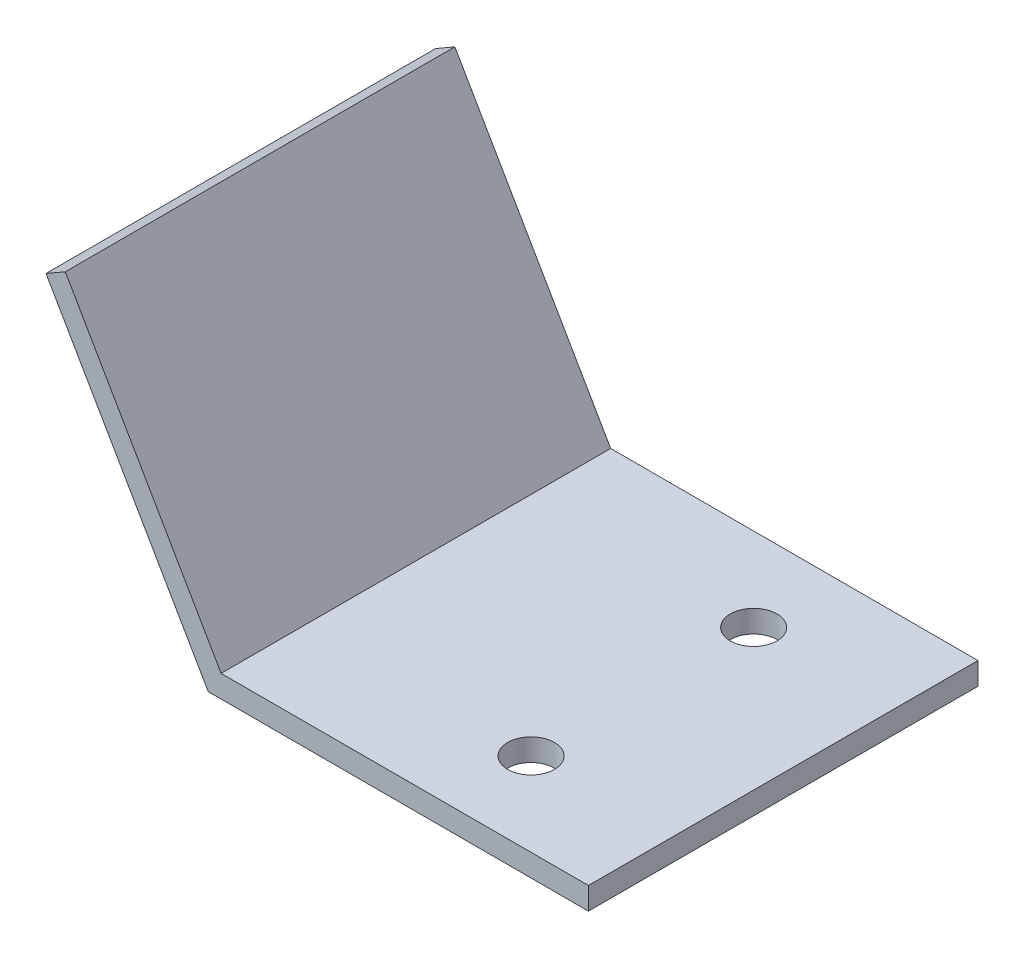
ISO-10303-21;
HEADER;
FILE_DESCRIPTION(('STEP AP214'),'2;1');
FILE_NAME('part.step','',(''),(''),'','','');
FILE_SCHEMA(('AUTOMOTIVE_DESIGN { 1 0 10303 214 1 1 1 1 }'));
ENDSEC;
DATA;
#1=APPLICATION_CONTEXT('core data for automotive mechanical design processes');
#2=APPLICATION_PROTOCOL_DEFINITION('international standard','automotive_design',2000,#1);
#3=PRODUCT_CONTEXT('',#1,'mechanical');
#4=PRODUCT('Part','Part','',(#3));
#5=PRODUCT_RELATED_PRODUCT_CATEGORY('part','',(#4));
#6=PRODUCT_DEFINITION_FORMATION('','',#4);
#7=PRODUCT_DEFINITION_CONTEXT('part definition',#1,'design');
#8=PRODUCT_DEFINITION('design','',#6,#7);
#9=PRODUCT_DEFINITION_SHAPE('','',#8);
#10=(LENGTH_UNIT() NAMED_UNIT(*) SI_UNIT(.MILLI.,.METRE.));
#11=(NAMED_UNIT(*) PLANE_ANGLE_UNIT() SI_UNIT($,.RADIAN.));
#12=(NAMED_UNIT(*) SI_UNIT($,.STERADIAN.) SOLID_ANGLE_UNIT());
#13=UNCERTAINTY_MEASURE_WITH_UNIT(LENGTH_MEASURE(1.E-05),#10,'distance_accuracy_value','');
#14=(GEOMETRIC_REPRESENTATION_CONTEXT(3) GLOBAL_UNCERTAINTY_ASSIGNED_CONTEXT((#13)) GLOBAL_UNIT_ASSIGNED_CONTEXT((#10,
#11,#12)) REPRESENTATION_CONTEXT('',''));
#15=CARTESIAN_POINT('',(0.,0.,0.));
#16=DIRECTION('',(0.,0.,1.));
#17=DIRECTION('',(1.,0.,0.));
#18=AXIS2_PLACEMENT_3D('',#15,#16,#17);
#19=CARTESIAN_POINT('',(-14.5773502691896,25.2487113059643,35.));
#20=DIRECTION('',(0.86602540378444,0.499999999999998,0.));
#21=DIRECTION('',(-0.499999999999998,0.86602540378444,0.));
#22=AXIS2_PLACEMENT_3D('',#19,#20,#21);
#23=PLANE('',#22);
#24=CARTESIAN_POINT('',(-7.49999999999997,12.9903810567666,27.5));
#25=DIRECTION('',(-0.86602540378444,-0.499999999999998,0.));
#26=DIRECTION('',(0.499999999999998,-0.86602540378444,0.));
#27=AXIS2_PLACEMENT_3D('',#24,#25,#26);
#28=CIRCLE('',#27,5.);
#29=CARTESIAN_POINT('',(-4.99999999999998,8.6602540378444,27.5));
#30=VERTEX_POINT('',#29);
#31=EDGE_CURVE('E191',#30,#30,#28,.T.);
#32=ORIENTED_EDGE('',*,*,#31,.F.);
#33=EDGE_LOOP('',(#32));
#34=FACE_BOUND('',#33,.T.);
#35=CARTESIAN_POINT('',(-7.49999999999997,12.9903810567666,7.5));
#36=DIRECTION('',(-0.86602540378444,-0.499999999999998,0.));
#37=DIRECTION('',(-0.499999999999998,0.86602540378444,0.));
#38=AXIS2_PLACEMENT_3D('',#35,#36,#37);
#39=CIRCLE('',#38,5.);
#40=CARTESIAN_POINT('',(-4.99999999999998,8.6602540378444,7.5));
#41=VERTEX_POINT('',#40);
#42=EDGE_CURVE('E194',#41,#41,#39,.T.);
#43=ORIENTED_EDGE('',*,*,#42,.F.);
#44=EDGE_LOOP('',(#43));
#45=FACE_BOUND('',#44,.T.);
#46=DIRECTION('',(0.499999999999998,-0.86602540378444,0.));
#47=VECTOR('',#46,1.);
#48=CARTESIAN_POINT('',(-14.5773502691896,25.2487113059643,0.));
#49=LINE('',#48,#47);
#50=CARTESIAN_POINT('',(-14.5773502691896,25.2487113059643,0.));
#51=VERTEX_POINT('',#50);
#52=CARTESIAN_POINT('',(0.,0.,0.));
#53=VERTEX_POINT('',#52);
#54=EDGE_CURVE('E126',#51,#53,#49,.T.);
#55=ORIENTED_EDGE('',*,*,#54,.T.);
#56=DIRECTION('',(0.,0.,-1.));
#57=VECTOR('',#56,1.);
#58=CARTESIAN_POINT('',(0.,0.,35.));
#59=LINE('',#58,#57);
#60=CARTESIAN_POINT('',(0.,0.,35.));
#61=VERTEX_POINT('',#60);
#62=EDGE_CURVE('E11',#61,#53,#59,.T.);
#63=ORIENTED_EDGE('',*,*,#62,.F.);
#64=DIRECTION('',(0.499999999999998,-0.86602540378444,0.));
#65=VECTOR('',#64,1.);
#66=CARTESIAN_POINT('',(-14.5773502691896,25.2487113059643,35.));
#67=LINE('',#66,#65);
#68=CARTESIAN_POINT('',(-14.5773502691896,25.2487113059643,35.));
#69=VERTEX_POINT('',#68);
#70=EDGE_CURVE('E136',#69,#61,#67,.T.);
#71=ORIENTED_EDGE('',*,*,#70,.F.);
#72=DIRECTION('',(0.,0.,-1.));
#73=VECTOR('',#72,1.);
#74=CARTESIAN_POINT('',(-14.5773502691896,25.2487113059643,35.));
#75=LINE('',#74,#73);
#76=EDGE_CURVE('E122',#69,#51,#75,.T.);
#77=ORIENTED_EDGE('',*,*,#76,.T.);
#78=EDGE_LOOP('',(#55,#63,#71,#77));
#79=FACE_BOUND('',#78,.T.);
#80=ADVANCED_FACE('F40',(#34,#45,#79),#23,.F.);
#81=CARTESIAN_POINT('',(0.,0.,35.));
#82=DIRECTION('',(0.,1.,0.));
#83=DIRECTION('',(-1.,0.,0.));
#84=AXIS2_PLACEMENT_3D('',#81,#82,#83);
#85=PLANE('',#84);
#86=CARTESIAN_POINT('',(21.5,0.,27.5));
#87=DIRECTION('',(0.,-1.,0.));
#88=DIRECTION('',(1.,0.,0.));
#89=AXIS2_PLACEMENT_3D('',#86,#87,#88);
#90=CIRCLE('',#89,2.1);
#91=CARTESIAN_POINT('',(23.6,0.,27.5));
#92=VERTEX_POINT('',#91);
#93=EDGE_CURVE('E143',#92,#92,#90,.T.);
#94=ORIENTED_EDGE('',*,*,#93,.F.);
#95=EDGE_LOOP('',(#94));
#96=FACE_BOUND('',#95,.T.);
#97=CARTESIAN_POINT('',(21.5,0.,7.50000000000001));
#98=DIRECTION('',(0.,-1.,0.));
#99=DIRECTION('',(-1.,0.,0.));
#100=AXIS2_PLACEMENT_3D('',#97,#98,#99);
#101=CIRCLE('',#100,2.1);
#102=CARTESIAN_POINT('',(23.6,0.,7.50000000000001));
#103=VERTEX_POINT('',#102);
#104=EDGE_CURVE('E148',#103,#103,#101,.T.);
#105=ORIENTED_EDGE('',*,*,#104,.F.);
#106=EDGE_LOOP('',(#105));
#107=FACE_BOUND('',#106,.T.);
#108=DIRECTION('',(1.,0.,0.));
#109=VECTOR('',#108,1.);
#110=CARTESIAN_POINT('',(0.,0.,0.));
#111=LINE('',#110,#109);
#112=CARTESIAN_POINT('',(34.1547005383792,0.,0.));
#113=VERTEX_POINT('',#112);
#114=EDGE_CURVE('E129',#53,#113,#111,.T.);
#115=ORIENTED_EDGE('',*,*,#114,.T.);
#116=DIRECTION('',(0.,0.,-1.));
#117=VECTOR('',#116,1.);
#118=CARTESIAN_POINT('',(34.1547005383792,0.,35.));
#119=LINE('',#118,#117);
#120=CARTESIAN_POINT('',(34.1547005383792,0.,35.));
#121=VERTEX_POINT('',#120);
#122=EDGE_CURVE('E49',#121,#113,#119,.T.);
#123=ORIENTED_EDGE('',*,*,#122,.F.);
#124=DIRECTION('',(1.,0.,0.));
#125=VECTOR('',#124,1.);
#126=CARTESIAN_POINT('',(0.,0.,35.));
#127=LINE('',#126,#125);
#128=EDGE_CURVE('E95',#61,#121,#127,.T.);
#129=ORIENTED_EDGE('',*,*,#128,.F.);
#130=ORIENTED_EDGE('',*,*,#62,.T.);
#131=EDGE_LOOP('',(#115,#123,#129,#130));
#132=FACE_BOUND('',#131,.T.);
#133=ADVANCED_FACE('F162',(#96,#107,#132),#85,.F.);
#134=CARTESIAN_POINT('',(34.1547005383792,0.,35.));
#135=DIRECTION('',(-1.,0.,0.));
#136=DIRECTION('',(0.,0.,1.));
#137=AXIS2_PLACEMENT_3D('',#134,#135,#136);
#138=PLANE('',#137);
#139=DIRECTION('',(0.,1.,0.));
#140=VECTOR('',#139,1.);
#141=CARTESIAN_POINT('',(34.1547005383792,0.,0.));
#142=LINE('',#141,#140);
#143=CARTESIAN_POINT('',(34.1547005383792,2.,0.));
#144=VERTEX_POINT('',#143);
#145=EDGE_CURVE('E131',#113,#144,#142,.T.);
#146=ORIENTED_EDGE('',*,*,#145,.T.);
#147=DIRECTION('',(0.,0.,-1.));
#148=VECTOR('',#147,1.);
#149=CARTESIAN_POINT('',(34.1547005383792,2.,35.));
#150=LINE('',#149,#148);
#151=CARTESIAN_POINT('',(34.1547005383792,2.,35.));
#152=VERTEX_POINT('',#151);
#153=EDGE_CURVE('E117',#152,#144,#150,.T.);
#154=ORIENTED_EDGE('',*,*,#153,.F.);
#155=DIRECTION('',(0.,1.,0.));
#156=VECTOR('',#155,1.);
#157=CARTESIAN_POINT('',(34.1547005383792,0.,35.));
#158=LINE('',#157,#156);
#159=EDGE_CURVE('E108',#121,#152,#158,.T.);
#160=ORIENTED_EDGE('',*,*,#159,.F.);
#161=ORIENTED_EDGE('',*,*,#122,.T.);
#162=EDGE_LOOP('',(#146,#154,#160,#161));
#163=FACE_BOUND('',#162,.T.);
#164=ADVANCED_FACE('F165',(#163),#138,.F.);
#165=CARTESIAN_POINT('',(34.1547005383792,2.,35.));
#166=DIRECTION('',(0.,-1.,0.));
#167=DIRECTION('',(1.,0.,0.));
#168=AXIS2_PLACEMENT_3D('',#165,#166,#167);
#169=PLANE('',#168);
#170=CARTESIAN_POINT('',(21.5,2.,27.5));
#171=DIRECTION('',(0.,-1.,0.));
#172=DIRECTION('',(1.,0.,0.));
#173=AXIS2_PLACEMENT_3D('',#170,#171,#172);
#174=CIRCLE('',#173,2.1);
#175=CARTESIAN_POINT('',(23.6,2.,27.5));
#176=VERTEX_POINT('',#175);
#177=EDGE_CURVE('E43',#176,#176,#174,.T.);
#178=ORIENTED_EDGE('',*,*,#177,.T.);
#179=EDGE_LOOP('',(#178));
#180=FACE_BOUND('',#179,.T.);
#181=CARTESIAN_POINT('',(21.5,2.,7.50000000000001));
#182=DIRECTION('',(0.,-1.,0.));
#183=DIRECTION('',(1.,0.,0.));
#184=AXIS2_PLACEMENT_3D('',#181,#182,#183);
#185=CIRCLE('',#184,2.1);
#186=CARTESIAN_POINT('',(23.6,2.,7.50000000000001));
#187=VERTEX_POINT('',#186);
#188=EDGE_CURVE('E141',#187,#187,#185,.T.);
#189=ORIENTED_EDGE('',*,*,#188,.T.);
#190=EDGE_LOOP('',(#189));
#191=FACE_BOUND('',#190,.T.);
#192=DIRECTION('',(-1.,0.,0.));
#193=VECTOR('',#192,1.);
#194=CARTESIAN_POINT('',(34.1547005383792,2.,0.));
#195=LINE('',#194,#193);
#196=CARTESIAN_POINT('',(1.15470053837926,2.,0.));
#197=VERTEX_POINT('',#196);
#198=EDGE_CURVE('E116',#144,#197,#195,.T.);
#199=ORIENTED_EDGE('',*,*,#198,.T.);
#200=DIRECTION('',(0.,0.,-1.));
#201=VECTOR('',#200,1.);
#202=CARTESIAN_POINT('',(1.15470053837926,2.,35.));
#203=LINE('',#202,#201);
#204=CARTESIAN_POINT('',(1.15470053837926,2.,35.));
#205=VERTEX_POINT('',#204);
#206=EDGE_CURVE('E113',#205,#197,#203,.T.);
#207=ORIENTED_EDGE('',*,*,#206,.F.);
#208=DIRECTION('',(-1.,0.,0.));
#209=VECTOR('',#208,1.);
#210=CARTESIAN_POINT('',(34.1547005383792,2.,35.));
#211=LINE('',#210,#209);
#212=EDGE_CURVE('E102',#152,#205,#211,.T.);
#213=ORIENTED_EDGE('',*,*,#212,.F.);
#214=ORIENTED_EDGE('',*,*,#153,.T.);
#215=EDGE_LOOP('',(#199,#207,#213,#214));
#216=FACE_BOUND('',#215,.T.);
#217=ADVANCED_FACE('F114',(#180,#191,#216),#169,.F.);
#218=CARTESIAN_POINT('',(1.15470053837926,2.,35.));
#219=DIRECTION('',(-0.86602540378444,-0.499999999999998,0.));
#220=DIRECTION('',(0.499999999999998,-0.86602540378444,0.));
#221=AXIS2_PLACEMENT_3D('',#218,#219,#220);
#222=PLANE('',#221);
#223=DIRECTION('',(-0.499999999999998,0.86602540378444,0.));
#224=VECTOR('',#223,1.);
#225=CARTESIAN_POINT('',(1.15470053837926,2.,0.));
#226=LINE('',#225,#224);
#227=CARTESIAN_POINT('',(-12.8452994616207,26.2487113059643,0.));
#228=VERTEX_POINT('',#227);
#229=EDGE_CURVE('E81',#197,#228,#226,.T.);
#230=ORIENTED_EDGE('',*,*,#229,.T.);
#231=DIRECTION('',(0.,0.,-1.));
#232=VECTOR('',#231,1.);
#233=CARTESIAN_POINT('',(-12.8452994616207,26.2487113059643,35.));
#234=LINE('',#233,#232);
#235=CARTESIAN_POINT('',(-12.8452994616207,26.2487113059643,35.));
#236=VERTEX_POINT('',#235);
#237=EDGE_CURVE('E118',#236,#228,#234,.T.);
#238=ORIENTED_EDGE('',*,*,#237,.F.);
#239=DIRECTION('',(-0.499999999999998,0.86602540378444,0.));
#240=VECTOR('',#239,1.);
#241=CARTESIAN_POINT('',(1.15470053837926,2.,35.));
#242=LINE('',#241,#240);
#243=EDGE_CURVE('E106',#205,#236,#242,.T.);
#244=ORIENTED_EDGE('',*,*,#243,.F.);
#245=ORIENTED_EDGE('',*,*,#206,.T.);
#246=EDGE_LOOP('',(#230,#238,#244,#245));
#247=FACE_BOUND('',#246,.T.);
#248=ADVANCED_FACE('F120',(#247),#222,.F.);
#249=CARTESIAN_POINT('',(-12.8452994616207,26.2487113059643,35.));
#250=DIRECTION('',(0.5,-0.866025403784438,0.));
#251=DIRECTION('',(0.866025403784438,0.5,0.));
#252=AXIS2_PLACEMENT_3D('',#249,#250,#251);
#253=PLANE('',#252);
#254=DIRECTION('',(-0.866025403784438,-0.5,0.));
#255=VECTOR('',#254,1.);
#256=CARTESIAN_POINT('',(-12.8452994616207,26.2487113059643,0.));
#257=LINE('',#256,#255);
#258=EDGE_CURVE('E87',#228,#51,#257,.T.);
#259=ORIENTED_EDGE('',*,*,#258,.T.);
#260=ORIENTED_EDGE('',*,*,#76,.F.);
#261=DIRECTION('',(-0.866025403784438,-0.5,0.));
#262=VECTOR('',#261,1.);
#263=CARTESIAN_POINT('',(-12.8452994616207,26.2487113059643,35.));
#264=LINE('',#263,#262);
#265=EDGE_CURVE('E58',#236,#69,#264,.T.);
#266=ORIENTED_EDGE('',*,*,#265,.F.);
#267=ORIENTED_EDGE('',*,*,#237,.T.);
#268=EDGE_LOOP('',(#259,#260,#266,#267));
#269=FACE_BOUND('',#268,.T.);
#270=ADVANCED_FACE('F170',(#269),#253,.F.);
#271=CARTESIAN_POINT('',(0.,0.,35.));
#272=DIRECTION('',(0.,0.,-1.));
#273=DIRECTION('',(-1.,0.,0.));
#274=AXIS2_PLACEMENT_3D('',#271,#272,#273);
#275=PLANE('',#274);
#276=ORIENTED_EDGE('',*,*,#70,.T.);
#277=ORIENTED_EDGE('',*,*,#128,.T.);
#278=ORIENTED_EDGE('',*,*,#159,.T.);
#279=ORIENTED_EDGE('',*,*,#212,.T.);
#280=ORIENTED_EDGE('',*,*,#243,.T.);
#281=ORIENTED_EDGE('',*,*,#265,.T.);
#282=EDGE_LOOP('',(#276,#277,#278,#279,#280,#281));
#283=FACE_BOUND('',#282,.T.);
#284=ADVANCED_FACE('F104',(#283),#275,.F.);
#285=CARTESIAN_POINT('',(0.,0.,0.));
#286=DIRECTION('',(0.,0.,-1.));
#287=DIRECTION('',(-1.,0.,0.));
#288=AXIS2_PLACEMENT_3D('',#285,#286,#287);
#289=PLANE('',#288);
#290=ORIENTED_EDGE('',*,*,#54,.F.);
#291=ORIENTED_EDGE('',*,*,#258,.F.);
#292=ORIENTED_EDGE('',*,*,#229,.F.);
#293=ORIENTED_EDGE('',*,*,#198,.F.);
#294=ORIENTED_EDGE('',*,*,#145,.F.);
#295=ORIENTED_EDGE('',*,*,#114,.F.);
#296=EDGE_LOOP('',(#290,#291,#292,#293,#294,#295));
#297=FACE_BOUND('',#296,.T.);
#298=ADVANCED_FACE('F168',(#297),#289,.T.);
#299=CARTESIAN_POINT('',(21.5,26.2487113059643,7.50000000000001));
#300=DIRECTION('',(0.,-1.,0.));
#301=DIRECTION('',(1.,0.,0.));
#302=AXIS2_PLACEMENT_3D('',#299,#300,#301);
#303=CYLINDRICAL_SURFACE('',#302,2.1);
#304=CARTESIAN_POINT('',(23.6,0.,7.50000000000001));
#305=CARTESIAN_POINT('',(23.6,0.0208333333333333,7.50000000000001));
#306=CARTESIAN_POINT('',(23.6,0.0416666666666667,7.50000000000001));
#307=CARTESIAN_POINT('',(23.6,0.0833333333333334,7.50000000000001));
#308=CARTESIAN_POINT('',(23.6,0.104166666666667,7.50000000000001));
#309=CARTESIAN_POINT('',(23.6,0.145833333333333,7.50000000000001));
#310=CARTESIAN_POINT('',(23.6,0.166666666666667,7.50000000000001));
#311=CARTESIAN_POINT('',(23.6,0.208333333333334,7.50000000000001));
#312=CARTESIAN_POINT('',(23.6,0.229166666666667,7.50000000000001));
#313=CARTESIAN_POINT('',(23.6,0.270833333333334,7.50000000000001));
#314=CARTESIAN_POINT('',(23.6,0.291666666666667,7.50000000000001));
#315=CARTESIAN_POINT('',(23.6,0.333333333333334,7.50000000000001));
#316=CARTESIAN_POINT('',(23.6,0.354166666666667,7.50000000000001));
#317=CARTESIAN_POINT('',(23.6,0.395833333333334,7.50000000000001));
#318=CARTESIAN_POINT('',(23.6,0.416666666666667,7.50000000000001));
#319=CARTESIAN_POINT('',(23.6,0.458333333333334,7.50000000000001));
#320=CARTESIAN_POINT('',(23.6,0.479166666666667,7.50000000000001));
#321=CARTESIAN_POINT('',(23.6,0.520833333333334,7.50000000000001));
#322=CARTESIAN_POINT('',(23.6,0.541666666666667,7.50000000000001));
#323=CARTESIAN_POINT('',(23.6,0.583333333333334,7.50000000000001));
#324=CARTESIAN_POINT('',(23.6,0.604166666666667,7.50000000000001));
#325=CARTESIAN_POINT('',(23.6,0.645833333333334,7.50000000000001));
#326=CARTESIAN_POINT('',(23.6,0.666666666666667,7.50000000000001));
#327=CARTESIAN_POINT('',(23.6,0.708333333333334,7.50000000000001));
#328=CARTESIAN_POINT('',(23.6,0.729166666666667,7.50000000000001));
#329=CARTESIAN_POINT('',(23.6,0.770833333333334,7.50000000000001));
#330=CARTESIAN_POINT('',(23.6,0.791666666666667,7.50000000000001));
#331=CARTESIAN_POINT('',(23.6,0.833333333333334,7.50000000000001));
#332=CARTESIAN_POINT('',(23.6,0.854166666666667,7.50000000000001));
#333=CARTESIAN_POINT('',(23.6,0.895833333333334,7.50000000000001));
#334=CARTESIAN_POINT('',(23.6,0.916666666666668,7.50000000000001));
#335=CARTESIAN_POINT('',(23.6,0.958333333333334,7.50000000000001));
#336=CARTESIAN_POINT('',(23.6,0.979166666666668,7.50000000000001));
#337=CARTESIAN_POINT('',(23.6,1.02083333333333,7.50000000000001));
#338=CARTESIAN_POINT('',(23.6,1.04166666666667,7.50000000000001));
#339=CARTESIAN_POINT('',(23.6,1.08333333333333,7.50000000000001));
#340=CARTESIAN_POINT('',(23.6,1.10416666666667,7.50000000000001));
#341=CARTESIAN_POINT('',(23.6,1.14583333333333,7.50000000000001));
#342=CARTESIAN_POINT('',(23.6,1.16666666666667,7.50000000000001));
#343=CARTESIAN_POINT('',(23.6,1.20833333333333,7.50000000000001));
#344=CARTESIAN_POINT('',(23.6,1.22916666666667,7.50000000000001));
#345=CARTESIAN_POINT('',(23.6,1.27083333333333,7.50000000000001));
#346=CARTESIAN_POINT('',(23.6,1.29166666666667,7.50000000000001));
#347=CARTESIAN_POINT('',(23.6,1.33333333333333,7.50000000000001));
#348=CARTESIAN_POINT('',(23.6,1.35416666666667,7.50000000000001));
#349=CARTESIAN_POINT('',(23.6,1.39583333333333,7.50000000000001));
#350=CARTESIAN_POINT('',(23.6,1.41666666666667,7.50000000000001));
#351=CARTESIAN_POINT('',(23.6,1.45833333333333,7.50000000000001));
#352=CARTESIAN_POINT('',(23.6,1.47916666666667,7.50000000000001));
#353=CARTESIAN_POINT('',(23.6,1.52083333333333,7.50000000000001));
#354=CARTESIAN_POINT('',(23.6,1.54166666666667,7.50000000000001));
#355=CARTESIAN_POINT('',(23.6,1.58333333333333,7.50000000000001));
#356=CARTESIAN_POINT('',(23.6,1.60416666666667,7.50000000000001));
#357=CARTESIAN_POINT('',(23.6,1.64583333333333,7.50000000000001));
#358=CARTESIAN_POINT('',(23.6,1.66666666666667,7.50000000000001));
#359=CARTESIAN_POINT('',(23.6,1.70833333333333,7.50000000000001));
#360=CARTESIAN_POINT('',(23.6,1.72916666666667,7.50000000000001));
#361=CARTESIAN_POINT('',(23.6,1.77083333333334,7.50000000000001));
#362=CARTESIAN_POINT('',(23.6,1.79166666666667,7.50000000000001));
#363=CARTESIAN_POINT('',(23.6,1.83333333333334,7.50000000000001));
#364=CARTESIAN_POINT('',(23.6,1.85416666666667,7.50000000000001));
#365=CARTESIAN_POINT('',(23.6,1.89583333333334,7.50000000000001));
#366=CARTESIAN_POINT('',(23.6,1.91666666666667,7.50000000000001));
#367=CARTESIAN_POINT('',(23.6,1.95833333333334,7.50000000000001));
#368=CARTESIAN_POINT('',(23.6,1.97916666666667,7.50000000000001));
#369=CARTESIAN_POINT('',(23.6,2.,7.50000000000001));
#370=B_SPLINE_CURVE_WITH_KNOTS('',3,(#304,#305,#306,#307,#308,#309,#310,#311,#312,#313,#314,
#315,#316,#317,#318,#319,#320,#321,#322,#323,#324,#325,#326,#327,#328,#329,#330,#331,#332,#333,
#334,#335,#336,#337,#338,#339,#340,#341,#342,#343,#344,#345,#346,#347,#348,#349,#350,#351,#352,
#353,#354,#355,#356,#357,#358,#359,#360,#361,#362,#363,#364,#365,#366,#367,#368,#369),
.UNSPECIFIED.,.F.,.F.,(4,2,2,2,2,2,2,2,2,2,2,2,2,2,2,2,2,2,2,2,2,2,2,2,2,2,2,2,2,2,2,2,4),(0.,
0.0625000000000001,0.125,0.1875,0.25,0.3125,0.375,0.4375,0.5,0.5625,0.625000000000001,
0.687500000000001,0.750000000000001,0.812500000000001,0.875000000000001,0.937500000000001,1.,
1.0625,1.125,1.1875,1.25,1.3125,1.375,1.4375,1.5,1.5625,1.625,1.6875,1.75,1.8125,1.875,1.9375,
2.),.UNSPECIFIED.);
#371=EDGE_CURVE('BSEAM222',#103,#187,#370,.T.);
#372=ORIENTED_EDGE('',*,*,#104,.T.);
#373=ORIENTED_EDGE('',*,*,#188,.F.);
#374=ORIENTED_EDGE('',*,*,#371,.T.);
#375=ORIENTED_EDGE('',*,*,#371,.F.);
#376=EDGE_LOOP('',(#372,#374,#373,#375));
#377=FACE_BOUND('',#376,.T.);
#378=ADVANCED_FACE('F222',(#377),#303,.F.);
#379=CARTESIAN_POINT('',(21.5,26.2487113059643,27.5));
#380=DIRECTION('',(0.,-1.,0.));
#381=DIRECTION('',(1.,0.,0.));
#382=AXIS2_PLACEMENT_3D('',#379,#380,#381);
#383=CYLINDRICAL_SURFACE('',#382,2.1);
#384=CARTESIAN_POINT('',(23.6,0.,27.5));
#385=CARTESIAN_POINT('',(23.6,0.0208333333333333,27.5));
#386=CARTESIAN_POINT('',(23.6,0.0416666666666667,27.5));
#387=CARTESIAN_POINT('',(23.6,0.0833333333333334,27.5));
#388=CARTESIAN_POINT('',(23.6,0.104166666666667,27.5));
#389=CARTESIAN_POINT('',(23.6,0.145833333333333,27.5));
#390=CARTESIAN_POINT('',(23.6,0.166666666666667,27.5));
#391=CARTESIAN_POINT('',(23.6,0.208333333333334,27.5));
#392=CARTESIAN_POINT('',(23.6,0.229166666666667,27.5));
#393=CARTESIAN_POINT('',(23.6,0.270833333333334,27.5));
#394=CARTESIAN_POINT('',(23.6,0.291666666666667,27.5));
#395=CARTESIAN_POINT('',(23.6,0.333333333333334,27.5));
#396=CARTESIAN_POINT('',(23.6,0.354166666666667,27.5));
#397=CARTESIAN_POINT('',(23.6,0.395833333333334,27.5));
#398=CARTESIAN_POINT('',(23.6,0.416666666666667,27.5));
#399=CARTESIAN_POINT('',(23.6,0.458333333333334,27.5));
#400=CARTESIAN_POINT('',(23.6,0.479166666666667,27.5));
#401=CARTESIAN_POINT('',(23.6,0.520833333333334,27.5));
#402=CARTESIAN_POINT('',(23.6,0.541666666666667,27.5));
#403=CARTESIAN_POINT('',(23.6,0.583333333333334,27.5));
#404=CARTESIAN_POINT('',(23.6,0.604166666666667,27.5));
#405=CARTESIAN_POINT('',(23.6,0.645833333333334,27.5));
#406=CARTESIAN_POINT('',(23.6,0.666666666666667,27.5));
#407=CARTESIAN_POINT('',(23.6,0.708333333333334,27.5));
#408=CARTESIAN_POINT('',(23.6,0.729166666666667,27.5));
#409=CARTESIAN_POINT('',(23.6,0.770833333333334,27.5));
#410=CARTESIAN_POINT('',(23.6,0.791666666666667,27.5));
#411=CARTESIAN_POINT('',(23.6,0.833333333333334,27.5));
#412=CARTESIAN_POINT('',(23.6,0.854166666666667,27.5));
#413=CARTESIAN_POINT('',(23.6,0.895833333333334,27.5));
#414=CARTESIAN_POINT('',(23.6,0.916666666666668,27.5));
#415=CARTESIAN_POINT('',(23.6,0.958333333333334,27.5));
#416=CARTESIAN_POINT('',(23.6,0.979166666666668,27.5));
#417=CARTESIAN_POINT('',(23.6,1.02083333333333,27.5));
#418=CARTESIAN_POINT('',(23.6,1.04166666666667,27.5));
#419=CARTESIAN_POINT('',(23.6,1.08333333333333,27.5));
#420=CARTESIAN_POINT('',(23.6,1.10416666666667,27.5));
#421=CARTESIAN_POINT('',(23.6,1.14583333333333,27.5));
#422=CARTESIAN_POINT('',(23.6,1.16666666666667,27.5));
#423=CARTESIAN_POINT('',(23.6,1.20833333333333,27.5));
#424=CARTESIAN_POINT('',(23.6,1.22916666666667,27.5));
#425=CARTESIAN_POINT('',(23.6,1.27083333333333,27.5));
#426=CARTESIAN_POINT('',(23.6,1.29166666666667,27.5));
#427=CARTESIAN_POINT('',(23.6,1.33333333333333,27.5));
#428=CARTESIAN_POINT('',(23.6,1.35416666666667,27.5));
#429=CARTESIAN_POINT('',(23.6,1.39583333333333,27.5));
#430=CARTESIAN_POINT('',(23.6,1.41666666666667,27.5));
#431=CARTESIAN_POINT('',(23.6,1.45833333333333,27.5));
#432=CARTESIAN_POINT('',(23.6,1.47916666666667,27.5));
#433=CARTESIAN_POINT('',(23.6,1.52083333333333,27.5));
#434=CARTESIAN_POINT('',(23.6,1.54166666666667,27.5));
#435=CARTESIAN_POINT('',(23.6,1.58333333333333,27.5));
#436=CARTESIAN_POINT('',(23.6,1.60416666666667,27.5));
#437=CARTESIAN_POINT('',(23.6,1.64583333333333,27.5));
#438=CARTESIAN_POINT('',(23.6,1.66666666666667,27.5));
#439=CARTESIAN_POINT('',(23.6,1.70833333333333,27.5));
#440=CARTESIAN_POINT('',(23.6,1.72916666666667,27.5));
#441=CARTESIAN_POINT('',(23.6,1.77083333333334,27.5));
#442=CARTESIAN_POINT('',(23.6,1.79166666666667,27.5));
#443=CARTESIAN_POINT('',(23.6,1.83333333333334,27.5));
#444=CARTESIAN_POINT('',(23.6,1.85416666666667,27.5));
#445=CARTESIAN_POINT('',(23.6,1.89583333333334,27.5));
#446=CARTESIAN_POINT('',(23.6,1.91666666666667,27.5));
#447=CARTESIAN_POINT('',(23.6,1.95833333333334,27.5));
#448=CARTESIAN_POINT('',(23.6,1.97916666666667,27.5));
#449=CARTESIAN_POINT('',(23.6,2.,27.5));
#450=B_SPLINE_CURVE_WITH_KNOTS('',3,(#384,#385,#386,#387,#388,#389,#390,#391,#392,#393,#394,
#395,#396,#397,#398,#399,#400,#401,#402,#403,#404,#405,#406,#407,#408,#409,#410,#411,#412,#413,
#414,#415,#416,#417,#418,#419,#420,#421,#422,#423,#424,#425,#426,#427,#428,#429,#430,#431,#432,
#433,#434,#435,#436,#437,#438,#439,#440,#441,#442,#443,#444,#445,#446,#447,#448,#449),
.UNSPECIFIED.,.F.,.F.,(4,2,2,2,2,2,2,2,2,2,2,2,2,2,2,2,2,2,2,2,2,2,2,2,2,2,2,2,2,2,2,2,4),(0.,
0.0625000000000001,0.125,0.1875,0.25,0.3125,0.375,0.4375,0.5,0.5625,0.625000000000001,
0.687500000000001,0.750000000000001,0.812500000000001,0.875000000000001,0.937500000000001,1.,
1.0625,1.125,1.1875,1.25,1.3125,1.375,1.4375,1.5,1.5625,1.625,1.6875,1.75,1.8125,1.875,1.9375,
2.),.UNSPECIFIED.);
#451=EDGE_CURVE('BSEAM218',#92,#176,#450,.T.);
#452=ORIENTED_EDGE('',*,*,#93,.T.);
#453=ORIENTED_EDGE('',*,*,#177,.F.);
#454=ORIENTED_EDGE('',*,*,#451,.T.);
#455=ORIENTED_EDGE('',*,*,#451,.F.);
#456=EDGE_LOOP('',(#452,#454,#453,#455));
#457=FACE_BOUND('',#456,.T.);
#458=ADVANCED_FACE('F218',(#457),#383,.F.);
#459=CARTESIAN_POINT('',(-6.02775681356642,13.8403810567666,7.5));
#460=DIRECTION('',(-0.86602540378444,-0.499999999999998,0.));
#461=DIRECTION('',(0.499999999999998,-0.86602540378444,0.));
#462=AXIS2_PLACEMENT_3D('',#459,#460,#461);
#463=CYLINDRICAL_SURFACE('',#462,5.);
#464=CARTESIAN_POINT('',(-6.02775681356642,13.8403810567666,7.5));
#465=DIRECTION('',(-0.86602540378444,-0.499999999999998,0.));
#466=DIRECTION('',(-0.499999999999998,0.86602540378444,0.));
#467=AXIS2_PLACEMENT_3D('',#464,#465,#466);
#468=CIRCLE('',#467,5.);
#469=CARTESIAN_POINT('',(-3.52775681356643,9.51025403784439,7.5));
#470=VERTEX_POINT('',#469);
#471=EDGE_CURVE('E156',#470,#470,#468,.T.);
#472=CARTESIAN_POINT('',(-3.52775681356643,9.51025403784439,7.5));
#473=CARTESIAN_POINT('',(-3.54309268009178,9.50139987117773,7.5));
#474=CARTESIAN_POINT('',(-3.55842854661713,9.49254570451106,7.5));
#475=CARTESIAN_POINT('',(-3.58910027966783,9.47483737117773,7.5));
#476=CARTESIAN_POINT('',(-3.60443614619318,9.46598320451106,7.5));
#477=CARTESIAN_POINT('',(-3.63510787924388,9.44827487117773,7.5));
#478=CARTESIAN_POINT('',(-3.65044374576923,9.43942070451106,7.5));
#479=CARTESIAN_POINT('',(-3.68111547881993,9.42171237117773,7.5));
#480=CARTESIAN_POINT('',(-3.69645134534528,9.41285820451106,7.5));
#481=CARTESIAN_POINT('',(-3.72712307839597,9.39514987117773,7.5));
#482=CARTESIAN_POINT('',(-3.74245894492132,9.38629570451106,7.5));
#483=CARTESIAN_POINT('',(-3.77313067797202,9.36858737117773,7.5));
#484=CARTESIAN_POINT('',(-3.78846654449737,9.35973320451106,7.5));
#485=CARTESIAN_POINT('',(-3.81913827754807,9.34202487117773,7.5));
#486=CARTESIAN_POINT('',(-3.83447414407342,9.33317070451106,7.5));
#487=CARTESIAN_POINT('',(-3.86514587712412,9.31546237117773,7.5));
#488=CARTESIAN_POINT('',(-3.88048174364947,9.30660820451106,7.5));
#489=CARTESIAN_POINT('',(-3.91115347670017,9.28889987117773,7.5));
#490=CARTESIAN_POINT('',(-3.92648934322552,9.28004570451106,7.5));
#491=CARTESIAN_POINT('',(-3.95716107627622,9.26233737117773,7.5));
#492=CARTESIAN_POINT('',(-3.97249694280157,9.25348320451106,7.5));
#493=CARTESIAN_POINT('',(-4.00316867585227,9.23577487117773,7.5));
#494=CARTESIAN_POINT('',(-4.01850454237761,9.22692070451106,7.5));
#495=CARTESIAN_POINT('',(-4.04917627542831,9.20921237117773,7.5));
#496=CARTESIAN_POINT('',(-4.06451214195366,9.20035820451106,7.5));
#497=CARTESIAN_POINT('',(-4.09518387500436,9.18264987117773,7.5));
#498=CARTESIAN_POINT('',(-4.11051974152971,9.17379570451106,7.5));
#499=CARTESIAN_POINT('',(-4.14119147458041,9.15608737117773,7.5));
#500=CARTESIAN_POINT('',(-4.15652734110576,9.14723320451106,7.5));
#501=CARTESIAN_POINT('',(-4.18719907415646,9.12952487117773,7.5));
#502=CARTESIAN_POINT('',(-4.20253494068181,9.12067070451106,7.5));
#503=CARTESIAN_POINT('',(-4.23320667373251,9.10296237117773,7.5));
#504=CARTESIAN_POINT('',(-4.24854254025786,9.09410820451106,7.5));
#505=CARTESIAN_POINT('',(-4.27921427330855,9.07639987117773,7.5));
#506=CARTESIAN_POINT('',(-4.2945501398339,9.06754570451106,7.5));
#507=CARTESIAN_POINT('',(-4.3252218728846,9.04983737117773,7.5));
#508=CARTESIAN_POINT('',(-4.34055773940995,9.04098320451106,7.5));
#509=CARTESIAN_POINT('',(-4.37122947246065,9.02327487117773,7.5));
#510=CARTESIAN_POINT('',(-4.386565338986,9.01442070451106,7.5));
#511=CARTESIAN_POINT('',(-4.4172370720367,8.99671237117773,7.5));
#512=CARTESIAN_POINT('',(-4.43257293856205,8.98785820451106,7.5));
#513=CARTESIAN_POINT('',(-4.46324467161275,8.97014987117773,7.5));
#514=CARTESIAN_POINT('',(-4.4785805381381,8.96129570451106,7.5));
#515=CARTESIAN_POINT('',(-4.5092522711888,8.94358737117773,7.5));
#516=CARTESIAN_POINT('',(-4.52458813771415,8.93473320451106,7.5));
#517=CARTESIAN_POINT('',(-4.55525987076485,8.91702487117773,7.5));
#518=CARTESIAN_POINT('',(-4.57059573729019,8.90817070451106,7.5));
#519=CARTESIAN_POINT('',(-4.60126747034089,8.89046237117773,7.5));
#520=CARTESIAN_POINT('',(-4.61660333686624,8.88160820451106,7.5));
#521=CARTESIAN_POINT('',(-4.64727506991694,8.86389987117773,7.5));
#522=CARTESIAN_POINT('',(-4.66261093644229,8.85504570451106,7.5));
#523=CARTESIAN_POINT('',(-4.69328266949299,8.83733737117773,7.5));
#524=CARTESIAN_POINT('',(-4.70861853601834,8.82848320451106,7.5));
#525=CARTESIAN_POINT('',(-4.73929026906904,8.81077487117773,7.5));
#526=CARTESIAN_POINT('',(-4.75462613559439,8.80192070451106,7.5));
#527=CARTESIAN_POINT('',(-4.78529786864509,8.78421237117773,7.5));
#528=CARTESIAN_POINT('',(-4.80063373517044,8.77535820451106,7.5));
#529=CARTESIAN_POINT('',(-4.83130546822114,8.75764987117773,7.5));
#530=CARTESIAN_POINT('',(-4.84664133474648,8.74879570451106,7.5));
#531=CARTESIAN_POINT('',(-4.87731306779718,8.73108737117773,7.5));
#532=CARTESIAN_POINT('',(-4.89264893432253,8.72223320451106,7.5));
#533=CARTESIAN_POINT('',(-4.92332066737323,8.70452487117773,7.5));
#534=CARTESIAN_POINT('',(-4.93865653389858,8.69567070451106,7.5));
#535=CARTESIAN_POINT('',(-4.96932826694928,8.67796237117773,7.5));
#536=CARTESIAN_POINT('',(-4.98466413347463,8.66910820451106,7.5));
#537=CARTESIAN_POINT('',(-4.99999999999998,8.6602540378444,7.5));
#538=B_SPLINE_CURVE_WITH_KNOTS('',3,(#472,#473,#474,#475,#476,#477,#478,#479,#480,#481,#482,
#483,#484,#485,#486,#487,#488,#489,#490,#491,#492,#493,#494,#495,#496,#497,#498,#499,#500,#501,
#502,#503,#504,#505,#506,#507,#508,#509,#510,#511,#512,#513,#514,#515,#516,#517,#518,#519,#520,
#521,#522,#523,#524,#525,#526,#527,#528,#529,#530,#531,#532,#533,#534,#535,#536,#537),
.UNSPECIFIED.,.F.,.F.,(4,2,2,2,2,2,2,2,2,2,2,2,2,2,2,2,2,2,2,2,2,2,2,2,2,2,2,2,2,2,2,2,4),(0.,
0.0531249999999991,0.106249999999999,0.159375,0.212499999999999,0.265625,0.31875,
0.371874999999999,0.425,0.478124999999999,0.53125,0.584375,0.6375,0.690625,0.743749999999999,
0.796875,0.85,0.903124999999999,0.95625,1.009375,1.0625,1.115625,1.16875,1.221875,1.275,
1.328125,1.38125,1.434375,1.4875,1.540625,1.59375,1.646875,1.7),.UNSPECIFIED.);
#539=EDGE_CURVE('BSEAM214',#470,#41,#538,.T.);
#540=ORIENTED_EDGE('',*,*,#471,.F.);
#541=ORIENTED_EDGE('',*,*,#42,.T.);
#542=ORIENTED_EDGE('',*,*,#539,.T.);
#543=ORIENTED_EDGE('',*,*,#539,.F.);
#544=EDGE_LOOP('',(#540,#542,#541,#543));
#545=FACE_BOUND('',#544,.T.);
#546=ADVANCED_FACE('F214',(#545),#463,.F.);
#547=CARTESIAN_POINT('',(-6.02775681356642,13.8403810567666,7.5));
#548=DIRECTION('',(0.86602540378444,0.499999999999998,0.));
#549=DIRECTION('',(-0.499999999999998,0.86602540378444,0.));
#550=AXIS2_PLACEMENT_3D('',#547,#548,#549);
#551=PLANE('',#550);
#552=ORIENTED_EDGE('',*,*,#471,.T.);
#553=EDGE_LOOP('',(#552));
#554=FACE_BOUND('',#553,.T.);
#555=ADVANCED_FACE('F207',(#554),#551,.F.);
#556=CARTESIAN_POINT('',(-6.02775681356642,13.8403810567666,27.5));
#557=DIRECTION('',(-0.86602540378444,-0.499999999999998,0.));
#558=DIRECTION('',(0.499999999999998,-0.86602540378444,0.));
#559=AXIS2_PLACEMENT_3D('',#556,#557,#558);
#560=CYLINDRICAL_SURFACE('',#559,5.);
#561=CARTESIAN_POINT('',(-6.02775681356642,13.8403810567666,27.5));
#562=DIRECTION('',(-0.86602540378444,-0.499999999999998,0.));
#563=DIRECTION('',(0.499999999999998,-0.86602540378444,0.));
#564=AXIS2_PLACEMENT_3D('',#561,#562,#563);
#565=CIRCLE('',#564,5.);
#566=CARTESIAN_POINT('',(-3.52775681356643,9.5102540378444,27.5));
#567=VERTEX_POINT('',#566);
#568=EDGE_CURVE('E153',#567,#567,#565,.T.);
#569=CARTESIAN_POINT('',(-3.52775681356643,9.5102540378444,27.5));
#570=CARTESIAN_POINT('',(-3.54309268009178,9.50139987117773,27.5));
#571=CARTESIAN_POINT('',(-3.55842854661713,9.49254570451106,27.5));
#572=CARTESIAN_POINT('',(-3.58910027966783,9.47483737117773,27.5));
#573=CARTESIAN_POINT('',(-3.60443614619318,9.46598320451106,27.5));
#574=CARTESIAN_POINT('',(-3.63510787924388,9.44827487117773,27.5));
#575=CARTESIAN_POINT('',(-3.65044374576923,9.43942070451106,27.5));
#576=CARTESIAN_POINT('',(-3.68111547881993,9.42171237117773,27.5));
#577=CARTESIAN_POINT('',(-3.69645134534528,9.41285820451106,27.5));
#578=CARTESIAN_POINT('',(-3.72712307839598,9.39514987117773,27.5));
#579=CARTESIAN_POINT('',(-3.74245894492133,9.38629570451107,27.5));
#580=CARTESIAN_POINT('',(-3.77313067797202,9.36858737117773,27.5));
#581=CARTESIAN_POINT('',(-3.78846654449737,9.35973320451106,27.5));
#582=CARTESIAN_POINT('',(-3.81913827754807,9.34202487117773,27.5));
#583=CARTESIAN_POINT('',(-3.83447414407342,9.33317070451106,27.5));
#584=CARTESIAN_POINT('',(-3.86514587712412,9.31546237117773,27.5));
#585=CARTESIAN_POINT('',(-3.88048174364947,9.30660820451106,27.5));
#586=CARTESIAN_POINT('',(-3.91115347670017,9.28889987117773,27.5));
#587=CARTESIAN_POINT('',(-3.92648934322552,9.28004570451106,27.5));
#588=CARTESIAN_POINT('',(-3.95716107627622,9.26233737117773,27.5));
#589=CARTESIAN_POINT('',(-3.97249694280157,9.25348320451106,27.5));
#590=CARTESIAN_POINT('',(-4.00316867585227,9.23577487117773,27.5));
#591=CARTESIAN_POINT('',(-4.01850454237762,9.22692070451107,27.5));
#592=CARTESIAN_POINT('',(-4.04917627542832,9.20921237117773,27.5));
#593=CARTESIAN_POINT('',(-4.06451214195366,9.20035820451107,27.5));
#594=CARTESIAN_POINT('',(-4.09518387500436,9.18264987117773,27.5));
#595=CARTESIAN_POINT('',(-4.11051974152971,9.17379570451107,27.5));
#596=CARTESIAN_POINT('',(-4.14119147458041,9.15608737117773,27.5));
#597=CARTESIAN_POINT('',(-4.15652734110576,9.14723320451107,27.5));
#598=CARTESIAN_POINT('',(-4.18719907415646,9.12952487117773,27.5));
#599=CARTESIAN_POINT('',(-4.20253494068181,9.12067070451107,27.5));
#600=CARTESIAN_POINT('',(-4.23320667373251,9.10296237117773,27.5));
#601=CARTESIAN_POINT('',(-4.24854254025786,9.09410820451107,27.5));
#602=CARTESIAN_POINT('',(-4.27921427330856,9.07639987117773,27.5));
#603=CARTESIAN_POINT('',(-4.29455013983391,9.06754570451106,27.5));
#604=CARTESIAN_POINT('',(-4.32522187288461,9.04983737117773,27.5));
#605=CARTESIAN_POINT('',(-4.34055773940995,9.04098320451106,27.5));
#606=CARTESIAN_POINT('',(-4.37122947246065,9.02327487117773,27.5));
#607=CARTESIAN_POINT('',(-4.386565338986,9.01442070451107,27.5));
#608=CARTESIAN_POINT('',(-4.4172370720367,8.99671237117773,27.5));
#609=CARTESIAN_POINT('',(-4.43257293856205,8.98785820451107,27.5));
#610=CARTESIAN_POINT('',(-4.46324467161275,8.97014987117773,27.5));
#611=CARTESIAN_POINT('',(-4.4785805381381,8.96129570451107,27.5));
#612=CARTESIAN_POINT('',(-4.5092522711888,8.94358737117773,27.5));
#613=CARTESIAN_POINT('',(-4.52458813771415,8.93473320451107,27.5));
#614=CARTESIAN_POINT('',(-4.55525987076485,8.91702487117773,27.5));
#615=CARTESIAN_POINT('',(-4.5705957372902,8.90817070451107,27.5));
#616=CARTESIAN_POINT('',(-4.6012674703409,8.89046237117773,27.5));
#617=CARTESIAN_POINT('',(-4.61660333686625,8.88160820451107,27.5));
#618=CARTESIAN_POINT('',(-4.64727506991694,8.86389987117773,27.5));
#619=CARTESIAN_POINT('',(-4.66261093644229,8.85504570451107,27.5));
#620=CARTESIAN_POINT('',(-4.69328266949299,8.83733737117773,27.5));
#621=CARTESIAN_POINT('',(-4.70861853601834,8.82848320451107,27.5));
#622=CARTESIAN_POINT('',(-4.73929026906904,8.81077487117773,27.5));
#623=CARTESIAN_POINT('',(-4.75462613559439,8.80192070451107,27.5));
#624=CARTESIAN_POINT('',(-4.78529786864509,8.78421237117773,27.5));
#625=CARTESIAN_POINT('',(-4.80063373517044,8.77535820451107,27.5));
#626=CARTESIAN_POINT('',(-4.83130546822114,8.75764987117774,27.5));
#627=CARTESIAN_POINT('',(-4.84664133474649,8.74879570451107,27.5));
#628=CARTESIAN_POINT('',(-4.87731306779719,8.73108737117773,27.5));
#629=CARTESIAN_POINT('',(-4.89264893432254,8.72223320451107,27.5));
#630=CARTESIAN_POINT('',(-4.92332066737323,8.70452487117773,27.5));
#631=CARTESIAN_POINT('',(-4.93865653389858,8.69567070451107,27.5));
#632=CARTESIAN_POINT('',(-4.96932826694928,8.67796237117773,27.5));
#633=CARTESIAN_POINT('',(-4.98466413347463,8.66910820451107,27.5));
#634=CARTESIAN_POINT('',(-4.99999999999998,8.6602540378444,27.5));
#635=B_SPLINE_CURVE_WITH_KNOTS('',3,(#569,#570,#571,#572,#573,#574,#575,#576,#577,#578,#579,
#580,#581,#582,#583,#584,#585,#586,#587,#588,#589,#590,#591,#592,#593,#594,#595,#596,#597,#598,
#599,#600,#601,#602,#603,#604,#605,#606,#607,#608,#609,#610,#611,#612,#613,#614,#615,#616,#617,
#618,#619,#620,#621,#622,#623,#624,#625,#626,#627,#628,#629,#630,#631,#632,#633,#634),
.UNSPECIFIED.,.F.,.F.,(4,2,2,2,2,2,2,2,2,2,2,2,2,2,2,2,2,2,2,2,2,2,2,2,2,2,2,2,2,2,2,2,4),(0.,
0.0531250000000007,0.10625,0.159375,0.2125,0.265625,0.31875,0.371875,0.425,0.478125,0.53125,
0.584375,0.6375,0.690625,0.74375,0.796875,0.85,0.903125,0.95625,1.009375,1.0625,1.115625,
1.16875,1.221875,1.275,1.328125,1.38125,1.434375,1.4875,1.540625,1.59375,1.646875,1.7),.UNSPECIFIED.);
#636=EDGE_CURVE('BSEAM204',#567,#30,#635,.T.);
#637=ORIENTED_EDGE('',*,*,#568,.F.);
#638=ORIENTED_EDGE('',*,*,#31,.T.);
#639=ORIENTED_EDGE('',*,*,#636,.T.);
#640=ORIENTED_EDGE('',*,*,#636,.F.);
#641=EDGE_LOOP('',(#637,#639,#638,#640));
#642=FACE_BOUND('',#641,.T.);
#643=ADVANCED_FACE('F204',(#642),#560,.F.);
#644=CARTESIAN_POINT('',(-6.02775681356642,13.8403810567666,27.5));
#645=DIRECTION('',(-0.86602540378444,-0.499999999999998,0.));
#646=DIRECTION('',(0.499999999999998,-0.86602540378444,0.));
#647=AXIS2_PLACEMENT_3D('',#644,#645,#646);
#648=PLANE('',#647);
#649=ORIENTED_EDGE('',*,*,#568,.T.);
#650=EDGE_LOOP('',(#649));
#651=FACE_BOUND('',#650,.T.);
#652=ADVANCED_FACE('F202',(#651),#648,.T.);
#653=CLOSED_SHELL('',(#80,#133,#164,#217,#248,#270,#284,#298,#378,#458,#546,#555,#643,#652));
#654=MANIFOLD_SOLID_BREP('B2',#653);
#655=ADVANCED_BREP_SHAPE_REPRESENTATION('',(#18,#654),#14);
#656=SHAPE_DEFINITION_REPRESENTATION(#9,#655);
ENDSEC;
END-ISO-10303-21;
